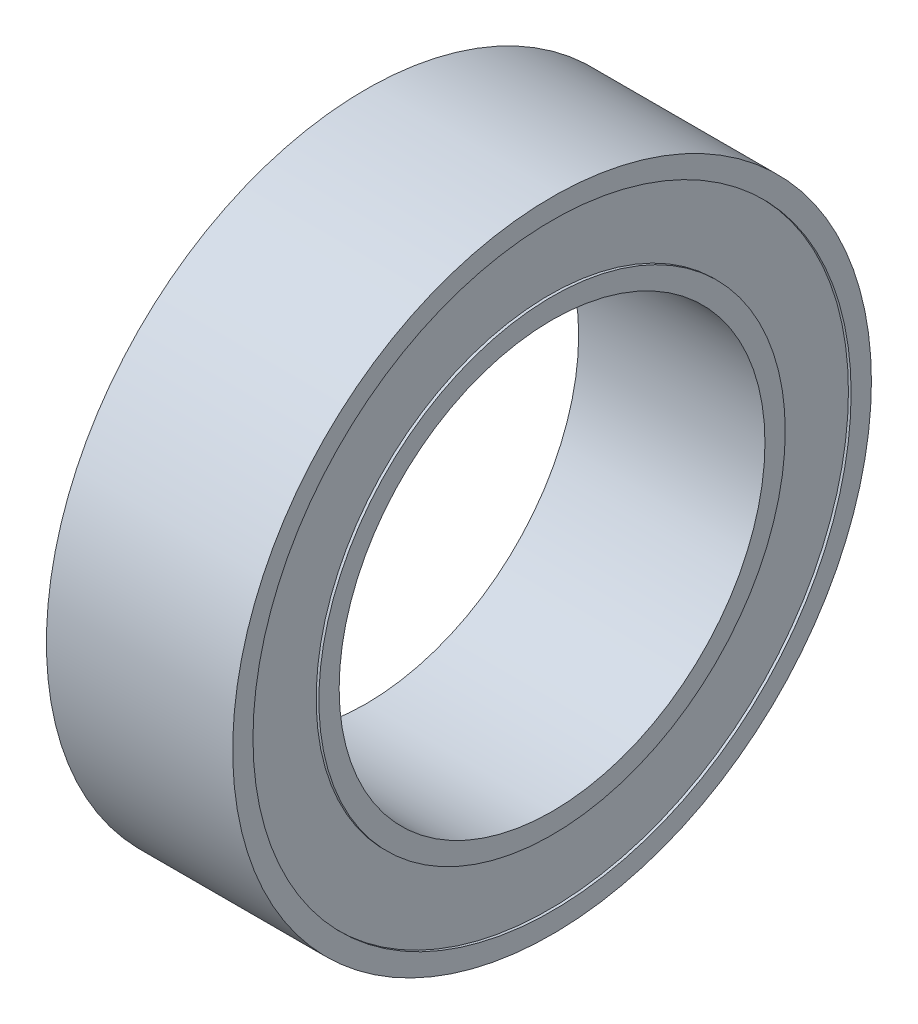
ISO-10303-21;
HEADER;
FILE_DESCRIPTION(('STEP AP214'),'2;1');
FILE_NAME('part.step','',(''),(''),'','','');
FILE_SCHEMA(('AUTOMOTIVE_DESIGN { 1 0 10303 214 1 1 1 1 }'));
ENDSEC;
DATA;
#1=APPLICATION_CONTEXT('core data for automotive mechanical design processes');
#2=APPLICATION_PROTOCOL_DEFINITION('international standard','automotive_design',2000,#1);
#3=PRODUCT_CONTEXT('',#1,'mechanical');
#4=PRODUCT('Part','Part','',(#3));
#5=PRODUCT_RELATED_PRODUCT_CATEGORY('part','',(#4));
#6=PRODUCT_DEFINITION_FORMATION('','',#4);
#7=PRODUCT_DEFINITION_CONTEXT('part definition',#1,'design');
#8=PRODUCT_DEFINITION('design','',#6,#7);
#9=PRODUCT_DEFINITION_SHAPE('','',#8);
#10=(LENGTH_UNIT() NAMED_UNIT(*) SI_UNIT(.MILLI.,.METRE.));
#11=(NAMED_UNIT(*) PLANE_ANGLE_UNIT() SI_UNIT($,.RADIAN.));
#12=(NAMED_UNIT(*) SI_UNIT($,.STERADIAN.) SOLID_ANGLE_UNIT());
#13=UNCERTAINTY_MEASURE_WITH_UNIT(LENGTH_MEASURE(1.E-05),#10,'distance_accuracy_value','');
#14=(GEOMETRIC_REPRESENTATION_CONTEXT(3) GLOBAL_UNCERTAINTY_ASSIGNED_CONTEXT((#13)) GLOBAL_UNIT_ASSIGNED_CONTEXT((#10,
#11,#12)) REPRESENTATION_CONTEXT('',''));
#15=CARTESIAN_POINT('',(0.,0.,0.));
#16=DIRECTION('',(0.,0.,1.));
#17=DIRECTION('',(1.,0.,0.));
#18=AXIS2_PLACEMENT_3D('',#15,#16,#17);
#19=CARTESIAN_POINT('',(-1.75,0.,0.));
#20=DIRECTION('',(1.,0.,0.));
#21=DIRECTION('',(0.,0.,-1.));
#22=AXIS2_PLACEMENT_3D('',#19,#20,#21);
#23=PLANE('',#22);
#24=CARTESIAN_POINT('',(-1.75,0.,0.));
#25=DIRECTION('',(1.,0.,0.));
#26=DIRECTION('',(0.,0.,-1.));
#27=AXIS2_PLACEMENT_3D('',#24,#25,#26);
#28=CIRCLE('',#27,4.);
#29=CARTESIAN_POINT('',(-1.75,0.,-4.));
#30=VERTEX_POINT('',#29);
#31=EDGE_CURVE('E56',#30,#30,#28,.T.);
#32=ORIENTED_EDGE('',*,*,#31,.T.);
#33=EDGE_LOOP('',(#32));
#34=FACE_BOUND('',#33,.T.);
#35=CARTESIAN_POINT('',(-1.75,0.,0.));
#36=DIRECTION('',(1.,0.,0.));
#37=DIRECTION('',(0.,0.,-1.));
#38=AXIS2_PLACEMENT_3D('',#35,#36,#37);
#39=CIRCLE('',#38,4.381);
#40=CARTESIAN_POINT('',(-1.75,0.,-4.381));
#41=VERTEX_POINT('',#40);
#42=EDGE_CURVE('E80',#41,#41,#39,.T.);
#43=ORIENTED_EDGE('',*,*,#42,.F.);
#44=EDGE_LOOP('',(#43));
#45=FACE_BOUND('',#44,.T.);
#46=ADVANCED_FACE('F43',(#34,#45),#23,.F.);
#47=CARTESIAN_POINT('',(1.75,0.,0.));
#48=DIRECTION('',(1.,0.,0.));
#49=DIRECTION('',(0.,0.,-1.));
#50=AXIS2_PLACEMENT_3D('',#47,#48,#49);
#51=PLANE('',#50);
#52=CARTESIAN_POINT('',(1.75,0.,0.));
#53=DIRECTION('',(1.,0.,0.));
#54=DIRECTION('',(0.,0.,-1.));
#55=AXIS2_PLACEMENT_3D('',#52,#53,#54);
#56=CIRCLE('',#55,4.);
#57=CARTESIAN_POINT('',(1.75,0.,-4.));
#58=VERTEX_POINT('',#57);
#59=EDGE_CURVE('E54',#58,#58,#56,.T.);
#60=ORIENTED_EDGE('',*,*,#59,.F.);
#61=EDGE_LOOP('',(#60));
#62=FACE_BOUND('',#61,.T.);
#63=CARTESIAN_POINT('',(1.75,0.,0.));
#64=DIRECTION('',(1.,0.,0.));
#65=DIRECTION('',(0.,0.,-1.));
#66=AXIS2_PLACEMENT_3D('',#63,#64,#65);
#67=CIRCLE('',#66,4.381);
#68=CARTESIAN_POINT('',(1.75,0.,-4.381));
#69=VERTEX_POINT('',#68);
#70=EDGE_CURVE('E68',#69,#69,#67,.T.);
#71=ORIENTED_EDGE('',*,*,#70,.T.);
#72=EDGE_LOOP('',(#71));
#73=FACE_BOUND('',#72,.T.);
#74=ADVANCED_FACE('F96',(#62,#73),#51,.T.);
#75=CARTESIAN_POINT('',(1.75,0.,0.));
#76=DIRECTION('',(1.,0.,0.));
#77=DIRECTION('',(0.,0.,-1.));
#78=AXIS2_PLACEMENT_3D('',#75,#76,#77);
#79=CIRCLE('',#78,5.619);
#80=CARTESIAN_POINT('',(1.75,0.,-5.619));
#81=VERTEX_POINT('',#80);
#82=EDGE_CURVE('E62',#81,#81,#79,.T.);
#83=ORIENTED_EDGE('',*,*,#82,.F.);
#84=EDGE_LOOP('',(#83));
#85=FACE_BOUND('',#84,.T.);
#86=CARTESIAN_POINT('',(1.75,0.,0.));
#87=DIRECTION('',(1.,0.,0.));
#88=DIRECTION('',(0.,0.,-1.));
#89=AXIS2_PLACEMENT_3D('',#86,#87,#88);
#90=CIRCLE('',#89,6.);
#91=CARTESIAN_POINT('',(1.75,0.,-6.));
#92=VERTEX_POINT('',#91);
#93=EDGE_CURVE('E10',#92,#92,#90,.T.);
#94=ORIENTED_EDGE('',*,*,#93,.T.);
#95=EDGE_LOOP('',(#94));
#96=FACE_BOUND('',#95,.T.);
#97=ADVANCED_FACE('F104',(#85,#96),#51,.T.);
#98=CARTESIAN_POINT('',(-1.75,0.,0.));
#99=DIRECTION('',(1.,0.,0.));
#100=DIRECTION('',(0.,0.,-1.));
#101=AXIS2_PLACEMENT_3D('',#98,#99,#100);
#102=CIRCLE('',#101,5.619);
#103=CARTESIAN_POINT('',(-1.75,0.,-5.619));
#104=VERTEX_POINT('',#103);
#105=EDGE_CURVE('E74',#104,#104,#102,.T.);
#106=ORIENTED_EDGE('',*,*,#105,.T.);
#107=EDGE_LOOP('',(#106));
#108=FACE_BOUND('',#107,.T.);
#109=CARTESIAN_POINT('',(-1.75,0.,0.));
#110=DIRECTION('',(1.,0.,0.));
#111=DIRECTION('',(0.,0.,-1.));
#112=AXIS2_PLACEMENT_3D('',#109,#110,#111);
#113=CIRCLE('',#112,6.);
#114=CARTESIAN_POINT('',(-1.75,0.,-6.));
#115=VERTEX_POINT('',#114);
#116=EDGE_CURVE('E47',#115,#115,#113,.T.);
#117=ORIENTED_EDGE('',*,*,#116,.F.);
#118=EDGE_LOOP('',(#117));
#119=FACE_BOUND('',#118,.T.);
#120=ADVANCED_FACE('F98',(#108,#119),#23,.F.);
#121=CARTESIAN_POINT('',(1.75,0.,0.));
#122=DIRECTION('',(-1.,0.,0.));
#123=DIRECTION('',(0.,0.,1.));
#124=AXIS2_PLACEMENT_3D('',#121,#122,#123);
#125=CYLINDRICAL_SURFACE('',#124,6.);
#126=ORIENTED_EDGE('',*,*,#93,.F.);
#127=EDGE_LOOP('',(#126));
#128=FACE_BOUND('',#127,.T.);
#129=ORIENTED_EDGE('',*,*,#116,.T.);
#130=EDGE_LOOP('',(#129));
#131=FACE_BOUND('',#130,.T.);
#132=ADVANCED_FACE('F45',(#128,#131),#125,.T.);
#133=CARTESIAN_POINT('',(1.75,0.,0.));
#134=DIRECTION('',(-1.,0.,0.));
#135=DIRECTION('',(0.,0.,1.));
#136=AXIS2_PLACEMENT_3D('',#133,#134,#135);
#137=CYLINDRICAL_SURFACE('',#136,4.);
#138=ORIENTED_EDGE('',*,*,#59,.T.);
#139=EDGE_LOOP('',(#138));
#140=FACE_BOUND('',#139,.T.);
#141=ORIENTED_EDGE('',*,*,#31,.F.);
#142=EDGE_LOOP('',(#141));
#143=FACE_BOUND('',#142,.T.);
#144=ADVANCED_FACE('F112',(#140,#143),#137,.F.);
#145=CARTESIAN_POINT('',(1.6992,0.,0.));
#146=DIRECTION('',(1.,0.,0.));
#147=DIRECTION('',(0.,0.,-1.));
#148=AXIS2_PLACEMENT_3D('',#145,#146,#147);
#149=CYLINDRICAL_SURFACE('',#148,5.619);
#150=CARTESIAN_POINT('',(1.6992,0.,0.));
#151=DIRECTION('',(1.,0.,0.));
#152=DIRECTION('',(0.,0.,-1.));
#153=AXIS2_PLACEMENT_3D('',#150,#151,#152);
#154=CIRCLE('',#153,5.619);
#155=CARTESIAN_POINT('',(1.6992,0.,-5.619));
#156=VERTEX_POINT('',#155);
#157=EDGE_CURVE('E59',#156,#156,#154,.T.);
#158=ORIENTED_EDGE('',*,*,#157,.F.);
#159=EDGE_LOOP('',(#158));
#160=FACE_BOUND('',#159,.T.);
#161=ORIENTED_EDGE('',*,*,#82,.T.);
#162=EDGE_LOOP('',(#161));
#163=FACE_BOUND('',#162,.T.);
#164=ADVANCED_FACE('F136',(#160,#163),#149,.F.);
#165=CARTESIAN_POINT('',(1.6992,0.,0.));
#166=DIRECTION('',(1.,0.,0.));
#167=DIRECTION('',(0.,0.,-1.));
#168=AXIS2_PLACEMENT_3D('',#165,#166,#167);
#169=PLANE('',#168);
#170=CARTESIAN_POINT('',(1.6992,0.,0.));
#171=DIRECTION('',(1.,0.,0.));
#172=DIRECTION('',(0.,0.,-1.));
#173=AXIS2_PLACEMENT_3D('',#170,#171,#172);
#174=CIRCLE('',#173,4.381);
#175=CARTESIAN_POINT('',(1.6992,0.,-4.381));
#176=VERTEX_POINT('',#175);
#177=EDGE_CURVE('E65',#176,#176,#174,.T.);
#178=ORIENTED_EDGE('',*,*,#177,.F.);
#179=EDGE_LOOP('',(#178));
#180=FACE_BOUND('',#179,.T.);
#181=ORIENTED_EDGE('',*,*,#157,.T.);
#182=EDGE_LOOP('',(#181));
#183=FACE_BOUND('',#182,.T.);
#184=ADVANCED_FACE('F132',(#180,#183),#169,.T.);
#185=CARTESIAN_POINT('',(1.6992,0.,0.));
#186=DIRECTION('',(1.,0.,0.));
#187=DIRECTION('',(0.,0.,-1.));
#188=AXIS2_PLACEMENT_3D('',#185,#186,#187);
#189=CYLINDRICAL_SURFACE('',#188,4.381);
#190=ORIENTED_EDGE('',*,*,#177,.T.);
#191=EDGE_LOOP('',(#190));
#192=FACE_BOUND('',#191,.T.);
#193=ORIENTED_EDGE('',*,*,#70,.F.);
#194=EDGE_LOOP('',(#193));
#195=FACE_BOUND('',#194,.T.);
#196=ADVANCED_FACE('F127',(#192,#195),#189,.T.);
#197=CARTESIAN_POINT('',(-1.6992,0.,0.));
#198=DIRECTION('',(-1.,0.,0.));
#199=DIRECTION('',(0.,0.,-1.));
#200=AXIS2_PLACEMENT_3D('',#197,#198,#199);
#201=PLANE('',#200);
#202=CARTESIAN_POINT('',(-1.6992,0.,0.));
#203=DIRECTION('',(1.,0.,0.));
#204=DIRECTION('',(0.,0.,-1.));
#205=AXIS2_PLACEMENT_3D('',#202,#203,#204);
#206=CIRCLE('',#205,5.619);
#207=CARTESIAN_POINT('',(-1.6992,0.,-5.619));
#208=VERTEX_POINT('',#207);
#209=EDGE_CURVE('E71',#208,#208,#206,.T.);
#210=ORIENTED_EDGE('',*,*,#209,.F.);
#211=EDGE_LOOP('',(#210));
#212=FACE_BOUND('',#211,.T.);
#213=CARTESIAN_POINT('',(-1.6992,0.,0.));
#214=DIRECTION('',(1.,0.,0.));
#215=DIRECTION('',(0.,0.,-1.));
#216=AXIS2_PLACEMENT_3D('',#213,#214,#215);
#217=CIRCLE('',#216,4.381);
#218=CARTESIAN_POINT('',(-1.6992,0.,-4.381));
#219=VERTEX_POINT('',#218);
#220=EDGE_CURVE('E77',#219,#219,#217,.T.);
#221=ORIENTED_EDGE('',*,*,#220,.T.);
#222=EDGE_LOOP('',(#221));
#223=FACE_BOUND('',#222,.T.);
#224=ADVANCED_FACE('F86',(#212,#223),#201,.T.);
#225=CARTESIAN_POINT('',(-1.6992,0.,0.));
#226=DIRECTION('',(-1.,0.,0.));
#227=DIRECTION('',(0.,0.,1.));
#228=AXIS2_PLACEMENT_3D('',#225,#226,#227);
#229=CYLINDRICAL_SURFACE('',#228,5.619);
#230=ORIENTED_EDGE('',*,*,#209,.T.);
#231=EDGE_LOOP('',(#230));
#232=FACE_BOUND('',#231,.T.);
#233=ORIENTED_EDGE('',*,*,#105,.F.);
#234=EDGE_LOOP('',(#233));
#235=FACE_BOUND('',#234,.T.);
#236=ADVANCED_FACE('F91',(#232,#235),#229,.F.);
#237=CARTESIAN_POINT('',(-1.6992,0.,0.));
#238=DIRECTION('',(-1.,0.,0.));
#239=DIRECTION('',(0.,0.,1.));
#240=AXIS2_PLACEMENT_3D('',#237,#238,#239);
#241=CYLINDRICAL_SURFACE('',#240,4.381);
#242=ORIENTED_EDGE('',*,*,#220,.F.);
#243=EDGE_LOOP('',(#242));
#244=FACE_BOUND('',#243,.T.);
#245=ORIENTED_EDGE('',*,*,#42,.T.);
#246=EDGE_LOOP('',(#245));
#247=FACE_BOUND('',#246,.T.);
#248=ADVANCED_FACE('F88',(#244,#247),#241,.T.);
#249=CLOSED_SHELL('',(#46,#74,#97,#120,#132,#144,#164,#184,#196,#224,#236,#248));
#250=MANIFOLD_SOLID_BREP('B2',#249);
#251=ADVANCED_BREP_SHAPE_REPRESENTATION('',(#18,#250),#14);
#252=SHAPE_DEFINITION_REPRESENTATION(#9,#251);
ENDSEC;
END-ISO-10303-21;
